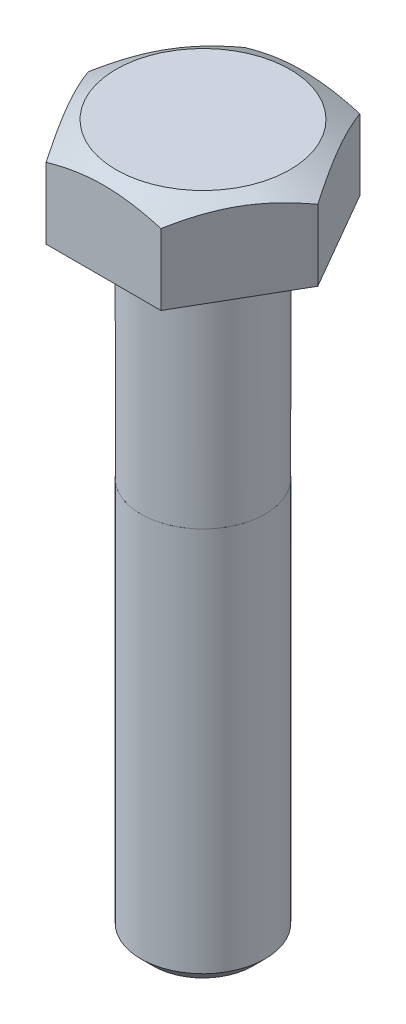
ISO-10303-21;
HEADER;
FILE_DESCRIPTION(('STEP AP214'),'2;1');
FILE_NAME('part.step','',(''),(''),'','','');
FILE_SCHEMA(('AUTOMOTIVE_DESIGN { 1 0 10303 214 1 1 1 1 }'));
ENDSEC;
DATA;
#1=APPLICATION_CONTEXT('core data for automotive mechanical design processes');
#2=APPLICATION_PROTOCOL_DEFINITION('international standard','automotive_design',2000,#1);
#3=PRODUCT_CONTEXT('',#1,'mechanical');
#4=PRODUCT('Part','Part','',(#3));
#5=PRODUCT_RELATED_PRODUCT_CATEGORY('part','',(#4));
#6=PRODUCT_DEFINITION_FORMATION('','',#4);
#7=PRODUCT_DEFINITION_CONTEXT('part definition',#1,'design');
#8=PRODUCT_DEFINITION('design','',#6,#7);
#9=PRODUCT_DEFINITION_SHAPE('','',#8);
#10=(LENGTH_UNIT() NAMED_UNIT(*) SI_UNIT(.MILLI.,.METRE.));
#11=(NAMED_UNIT(*) PLANE_ANGLE_UNIT() SI_UNIT($,.RADIAN.));
#12=(NAMED_UNIT(*) SI_UNIT($,.STERADIAN.) SOLID_ANGLE_UNIT());
#13=UNCERTAINTY_MEASURE_WITH_UNIT(LENGTH_MEASURE(1.E-05),#10,'distance_accuracy_value','');
#14=(GEOMETRIC_REPRESENTATION_CONTEXT(3) GLOBAL_UNCERTAINTY_ASSIGNED_CONTEXT((#13)) GLOBAL_UNIT_ASSIGNED_CONTEXT((#10,
#11,#12)) REPRESENTATION_CONTEXT('',''));
#15=CARTESIAN_POINT('',(0.,0.,0.));
#16=DIRECTION('',(0.,0.,1.));
#17=DIRECTION('',(1.,0.,0.));
#18=AXIS2_PLACEMENT_3D('',#15,#16,#17);
#19=CARTESIAN_POINT('',(0.,-28.5,0.));
#20=DIRECTION('',(0.,1.,0.));
#21=DIRECTION('',(0.,0.,1.));
#22=AXIS2_PLACEMENT_3D('',#19,#20,#21);
#23=CYLINDRICAL_SURFACE('',#22,2.5);
#24=CARTESIAN_POINT('',(0.,-28.,0.));
#25=DIRECTION('',(0.,-1.,0.));
#26=DIRECTION('',(0.,0.,-1.));
#27=AXIS2_PLACEMENT_3D('',#24,#25,#26);
#28=CIRCLE('',#27,2.5);
#29=CARTESIAN_POINT('',(0.,-28.,-2.5));
#30=VERTEX_POINT('',#29);
#31=EDGE_CURVE('E12',#30,#30,#28,.F.);
#32=ORIENTED_EDGE('',*,*,#31,.T.);
#33=EDGE_LOOP('',(#32));
#34=FACE_BOUND('',#33,.T.);
#35=CARTESIAN_POINT('',(0.,-12.5,0.));
#36=DIRECTION('',(0.,-1.,0.));
#37=DIRECTION('',(0.,0.,-1.));
#38=AXIS2_PLACEMENT_3D('',#35,#36,#37);
#39=CIRCLE('',#38,2.5);
#40=CARTESIAN_POINT('',(0.,-12.5,-2.5));
#41=VERTEX_POINT('',#40);
#42=EDGE_CURVE('E52',#41,#41,#39,.T.);
#43=ORIENTED_EDGE('',*,*,#42,.T.);
#44=EDGE_LOOP('',(#43));
#45=FACE_BOUND('',#44,.T.);
#46=ADVANCED_FACE('F41',(#34,#45),#23,.T.);
#47=CARTESIAN_POINT('',(0.,-28.5,0.));
#48=DIRECTION('',(0.,-1.,0.));
#49=DIRECTION('',(0.,0.,-1.));
#50=AXIS2_PLACEMENT_3D('',#47,#48,#49);
#51=PLANE('',#50);
#52=CARTESIAN_POINT('',(0.,-28.5,0.));
#53=DIRECTION('',(0.,-1.,0.));
#54=DIRECTION('',(0.,0.,-1.));
#55=AXIS2_PLACEMENT_3D('',#52,#53,#54);
#56=CIRCLE('',#55,2.);
#57=CARTESIAN_POINT('',(0.,-28.5,-2.));
#58=VERTEX_POINT('',#57);
#59=EDGE_CURVE('E48',#58,#58,#56,.T.);
#60=ORIENTED_EDGE('',*,*,#59,.T.);
#61=EDGE_LOOP('',(#60));
#62=FACE_BOUND('',#61,.T.);
#63=ADVANCED_FACE('F62',(#62),#51,.T.);
#64=CARTESIAN_POINT('',(0.,-12.5,0.));
#65=DIRECTION('',(0.,-1.,0.));
#66=DIRECTION('',(0.,0.,-1.));
#67=AXIS2_PLACEMENT_3D('',#64,#65,#66);
#68=PLANE('',#67);
#69=ORIENTED_EDGE('',*,*,#42,.F.);
#70=EDGE_LOOP('',(#69));
#71=FACE_BOUND('',#70,.T.);
#72=ADVANCED_FACE('F60',(#71),#68,.F.);
#73=CARTESIAN_POINT('',(0.,-28.5,0.));
#74=DIRECTION('',(0.,1.,0.));
#75=DIRECTION('',(0.,0.,1.));
#76=AXIS2_PLACEMENT_3D('',#73,#74,#75);
#77=CONICAL_SURFACE('',#76,2.,0.785398163397443);
#78=ORIENTED_EDGE('',*,*,#31,.F.);
#79=EDGE_LOOP('',(#78));
#80=FACE_BOUND('',#79,.T.);
#81=ORIENTED_EDGE('',*,*,#59,.F.);
#82=EDGE_LOOP('',(#81));
#83=FACE_BOUND('',#82,.T.);
#84=ADVANCED_FACE('F43',(#80,#83),#77,.T.);
#85=CLOSED_SHELL('',(#46,#63,#72,#84));
#86=MANIFOLD_SOLID_BREP('B2',#85);
#87=CARTESIAN_POINT('',(-2.30940107675855,-3.5,-3.99999999999997));
#88=DIRECTION('',(-0.866025403784442,0.,-0.499999999999995));
#89=DIRECTION('',(-0.499999999999995,0.,0.866025403784442));
#90=AXIS2_PLACEMENT_3D('',#87,#88,#89);
#91=PLANE('',#90);
#92=DIRECTION('',(0.,1.,0.));
#93=VECTOR('',#92,1.);
#94=CARTESIAN_POINT('',(-4.61880215351701,-3.5,0.));
#95=LINE('',#94,#93);
#96=CARTESIAN_POINT('',(-4.61880215351701,-3.5,0.));
#97=VERTEX_POINT('',#96);
#98=CARTESIAN_POINT('',(-4.61880215351701,-0.645940724502973,0.));
#99=VERTEX_POINT('',#98);
#100=EDGE_CURVE('E170',#97,#99,#95,.T.);
#101=ORIENTED_EDGE('',*,*,#100,.T.);
#102=CARTESIAN_POINT('',(-4.61891762357084,-0.646007393669577,0.000200000000000209));
#103=CARTESIAN_POINT('',(-4.5174314838138,-0.587393008243094,-0.175579150323229));
#104=CARTESIAN_POINT('',(-4.41506932144052,-0.534085456057075,-0.352875616326382));
#105=CARTESIAN_POINT('',(-4.2085725054774,-0.441036805341217,-0.710538593175709));
#106=CARTESIAN_POINT('',(-4.10443418285647,-0.401328623624518,-0.890911458970154));
#107=CARTESIAN_POINT('',(-3.89744813015756,-0.339517349875095,-1.24942181870279));
#108=CARTESIAN_POINT('',(-3.7946322465506,-0.317002866117705,-1.42750415293515));
#109=CARTESIAN_POINT('',(-3.58851671999024,-0.290125757741399,-1.78450671716652));
#110=CARTESIAN_POINT('',(-3.48521782616118,-0.285740876021762,-1.96342564964411));
#111=CARTESIAN_POINT('',(-3.2921997050462,-0.29486520753479,-2.29774284219674));
#112=CARTESIAN_POINT('',(-3.20245157692488,-0.306134088582814,-2.45319115998707));
#113=CARTESIAN_POINT('',(-3.02354002635499,-0.341849125393013,-2.76307505563505));
#114=CARTESIAN_POINT('',(-2.93437722268075,-0.366307480306352,-2.91750956174412));
#115=CARTESIAN_POINT('',(-2.75509682012357,-0.427451199514107,-3.22803232777457));
#116=CARTESIAN_POINT('',(-2.66500191089423,-0.46439573824968,-3.38408128806309));
#117=CARTESIAN_POINT('',(-2.48615580200005,-0.54824520714284,-3.69385183540382));
#118=CARTESIAN_POINT('',(-2.39740231122589,-0.595130436807552,-3.84757739077375));
#119=CARTESIAN_POINT('',(-2.30928560670471,-0.646007393669577,-4.00019999999997));
#120=B_SPLINE_CURVE_WITH_KNOTS('',3,(#102,#103,#104,#105,#106,#107,#108,#109,#110,#111,#112,
#113,#114,#115,#116,#117,#118,#119),.UNSPECIFIED.,.F.,.F.,(4,2,2,2,2,2,2,2,4),(0.,
0.634047835695966,1.26961969224543,1.88946157213122,2.50854226669297,3.04757825393384,
3.58711366126901,4.1386165314376,4.68903648037738),.UNSPECIFIED.);
#121=CARTESIAN_POINT('',(-2.30940107675896,-0.645940724502701,-3.99999999999997));
#122=VERTEX_POINT('',#121);
#123=EDGE_CURVE('E111',#99,#122,#120,.T.);
#124=ORIENTED_EDGE('',*,*,#123,.T.);
#125=DIRECTION('',(0.,1.,0.));
#126=VECTOR('',#125,1.);
#127=CARTESIAN_POINT('',(-2.30940107675855,-3.5,-3.99999999999997));
#128=LINE('',#127,#126);
#129=CARTESIAN_POINT('',(-2.30940107675855,-3.5,-3.99999999999997));
#130=VERTEX_POINT('',#129);
#131=EDGE_CURVE('E104',#130,#122,#128,.T.);
#132=ORIENTED_EDGE('',*,*,#131,.F.);
#133=DIRECTION('',(-0.499999999999995,0.,0.866025403784442));
#134=VECTOR('',#133,1.);
#135=CARTESIAN_POINT('',(-2.30940107675855,-3.5,-3.99999999999997));
#136=LINE('',#135,#134);
#137=EDGE_CURVE('E193',#130,#97,#136,.T.);
#138=ORIENTED_EDGE('',*,*,#137,.T.);
#139=EDGE_LOOP('',(#101,#124,#132,#138));
#140=FACE_BOUND('',#139,.T.);
#141=ADVANCED_FACE('F96',(#140),#91,.T.);
#142=CARTESIAN_POINT('',(2.30940107675847,-3.5,-4.00000000000002));
#143=DIRECTION('',(0.,0.,-1.));
#144=DIRECTION('',(-1.,0.,0.));
#145=AXIS2_PLACEMENT_3D('',#142,#143,#144);
#146=PLANE('',#145);
#147=ORIENTED_EDGE('',*,*,#131,.T.);
#148=CARTESIAN_POINT('',(-6.2386920841912,-2.25795293966222,-3.99999999999993));
#149=CARTESIAN_POINT('',(-6.0636462144156,-2.17289842349704,-3.99999999999993));
#150=CARTESIAN_POINT('',(-5.88820220942288,-2.08864943358983,-3.99999999999994));
#151=CARTESIAN_POINT('',(-5.53630625966822,-1.92221498867113,-3.99999999999994));
#152=CARTESIAN_POINT('',(-5.35985416432443,-1.84002985239064,-3.99999999999994));
#153=CARTESIAN_POINT('',(-5.00483857589394,-1.67776989271807,-3.99999999999994));
#154=CARTESIAN_POINT('',(-4.82626883952197,-1.59770868272851,-3.99999999999995));
#155=CARTESIAN_POINT('',(-4.46772093692709,-1.4408169744459,-3.99999999999995));
#156=CARTESIAN_POINT('',(-4.28774283678467,-1.36398632564012,-3.99999999999995));
#157=CARTESIAN_POINT('',(-3.92023096366145,-1.2119836575685,-3.99999999999996));
#158=CARTESIAN_POINT('',(-3.73264131099652,-1.13694601597286,-3.99999999999996));
#159=CARTESIAN_POINT('',(-3.35528065120837,-0.992464755220284,-3.99999999999996));
#160=CARTESIAN_POINT('',(-3.16550940404798,-0.923021758496333,-3.99999999999996));
#161=CARTESIAN_POINT('',(-2.78382716206718,-0.79152628438738,-3.99999999999997));
#162=CARTESIAN_POINT('',(-2.59192126079333,-0.729459169059146,-3.99999999999997));
#163=CARTESIAN_POINT('',(-2.20535721062783,-0.614683334100919,-3.99999999999997));
#164=CARTESIAN_POINT('',(-2.01069993747645,-0.561971706021506,-3.99999999999998));
#165=CARTESIAN_POINT('',(-1.61956762794624,-0.468684492535562,-3.99999999999998));
#166=CARTESIAN_POINT('',(-1.42310827900288,-0.428044334831883,-3.99999999999998));
#167=CARTESIAN_POINT('',(-1.02771053321186,-0.361187404628872,-3.99999999999999));
#168=CARTESIAN_POINT('',(-0.8287723969665,-0.334969128782129,-3.99999999999999));
#169=CARTESIAN_POINT('',(-0.43202422198551,-0.299389076257038,-3.99999999999999));
#170=CARTESIAN_POINT('',(-0.23423437117117,-0.289807740258372,-3.99999999999999));
#171=CARTESIAN_POINT('',(0.161454851148497,-0.287733658952416,-4.));
#172=CARTESIAN_POINT('',(0.359354225467821,-0.295241375238883,-4.));
#173=CARTESIAN_POINT('',(0.69421587993035,-0.321869109204495,-4.));
#174=CARTESIAN_POINT('',(0.831532532248929,-0.336797639120489,-4.));
#175=CARTESIAN_POINT('',(1.10517829494913,-0.373972722722937,-4.00000000000001));
#176=CARTESIAN_POINT('',(1.24150727333933,-0.396220236721733,-4.00000000000001));
#177=CARTESIAN_POINT('',(1.64881504225618,-0.472773589082371,-4.00000000000001));
#178=CARTESIAN_POINT('',(1.91797375754035,-0.536877529328741,-4.00000000000002));
#179=CARTESIAN_POINT('',(2.32062768760559,-0.648292970756896,-4.00000000000002));
#180=CARTESIAN_POINT('',(2.45620102533998,-0.688523438763919,-4.00000000000002));
#181=CARTESIAN_POINT('',(2.72603047833974,-0.773221425389597,-4.00000000000002));
#182=CARTESIAN_POINT('',(2.86028658354053,-0.817688976354765,-4.00000000000002));
#183=CARTESIAN_POINT('',(3.12752526120129,-0.910142476964991,-4.00000000000003));
#184=CARTESIAN_POINT('',(3.26050820568575,-0.958127361002033,-4.00000000000003));
#185=CARTESIAN_POINT('',(3.5253661454258,-1.05704497136852,-4.00000000000003));
#186=CARTESIAN_POINT('',(3.6572411660242,-1.10797763005872,-4.00000000000003));
#187=CARTESIAN_POINT('',(4.01446721288898,-1.24979807871173,-4.00000000000004));
#188=CARTESIAN_POINT('',(4.23886403870353,-1.34308714618287,-4.00000000000004));
#189=CARTESIAN_POINT('',(4.68535569758662,-1.5350394226801,-4.00000000000005));
#190=CARTESIAN_POINT('',(4.90745027448332,-1.6337032222735,-4.00000000000005));
#191=CARTESIAN_POINT('',(5.3498652945355,-1.83511614209277,-4.00000000000005));
#192=CARTESIAN_POINT('',(5.57018510122429,-1.93786665574931,-4.00000000000005));
#193=CARTESIAN_POINT('',(6.00935088451956,-2.14647688038397,-4.00000000000006));
#194=CARTESIAN_POINT('',(6.2281968167458,-2.25233668447678,-4.00000000000006));
#195=CARTESIAN_POINT('',(6.66503589878404,-2.46664235343326,-4.00000000000006));
#196=CARTESIAN_POINT('',(6.88302720893254,-2.57509196066299,-4.00000000000007));
#197=CARTESIAN_POINT('',(7.31804173282997,-2.79391769327291,-4.00000000000007));
#198=CARTESIAN_POINT('',(7.53506493662401,-2.90429383840633,-4.00000000000007));
#199=CARTESIAN_POINT('',(8.18485903571492,-3.2376704329208,-4.00000000000008));
#200=CARTESIAN_POINT('',(8.61645133516242,-3.46296704561798,-4.00000000000009));
#201=CARTESIAN_POINT('',(9.4316201905298,-3.8934242038609,-4.00000000000009));
#202=CARTESIAN_POINT('',(9.81541486293091,-4.09817365920157,-4.0000000000001));
#203=CARTESIAN_POINT('',(10.5817465955931,-4.51006741140322,-4.00000000000011));
#204=CARTESIAN_POINT('',(10.9642835774267,-4.71721185410569,-4.00000000000011));
#205=CARTESIAN_POINT('',(11.7271405277234,-5.1325892408828,-4.00000000000012));
#206=CARTESIAN_POINT('',(12.1074636535812,-5.34081639518074,-4.00000000000012));
#207=CARTESIAN_POINT('',(12.8673260809044,-5.75862691883248,-4.00000000000013));
#208=CARTESIAN_POINT('',(13.2468654409213,-5.96821018165787,-4.00000000000013));
#209=CARTESIAN_POINT('',(13.6261299907272,-6.178286570007,-4.00000000000014));
#210=B_SPLINE_CURVE_WITH_KNOTS('',3,(#148,#149,#150,#151,#152,#153,#154,#155,#156,#157,#158,
#159,#160,#161,#162,#163,#164,#165,#166,#167,#168,#169,#170,#171,#172,#173,#174,#175,#176,#177,
#178,#179,#180,#181,#182,#183,#184,#185,#186,#187,#188,#189,#190,#191,#192,#193,#194,#195,#196,
#197,#198,#199,#200,#201,#202,#203,#204,#205,#206,#207,#208,#209),.UNSPECIFIED.,.F.,.F.,(4,2,2,
2,2,2,2,2,2,2,2,2,2,2,2,2,2,2,2,2,2,2,2,2,2,2,2,2,2,2,4),(0.,0.583854507649928,1.16779863509232,
1.75486117528229,2.34189633369219,2.94795004536287,3.55407109077563,4.15896841535693,
4.76367735779939,5.36509081790958,5.96644157435888,6.55979415614866,7.15316276522268,
7.56733997131308,7.98157154262904,8.8104571980024,9.2346697003411,9.65888544143973,
10.0829731895213,10.5070512103968,11.2359937181684,11.9650164832164,12.6942899877904,
13.4235853544074,14.1540073506965,14.8844368405732,16.3449713937757,17.6499479609235,
18.9550044168959,20.2557851154095,21.556464843156),.UNSPECIFIED.);
#211=CARTESIAN_POINT('',(2.30940107675847,-0.645940724502973,-4.00000000000002));
#212=VERTEX_POINT('',#211);
#213=EDGE_CURVE('E200',#122,#212,#210,.T.);
#214=ORIENTED_EDGE('',*,*,#213,.T.);
#215=DIRECTION('',(0.,1.,0.));
#216=VECTOR('',#215,1.);
#217=CARTESIAN_POINT('',(2.30940107675847,-3.5,-4.00000000000002));
#218=LINE('',#217,#216);
#219=CARTESIAN_POINT('',(2.30940107675847,-3.5,-4.00000000000002));
#220=VERTEX_POINT('',#219);
#221=EDGE_CURVE('E178',#220,#212,#218,.T.);
#222=ORIENTED_EDGE('',*,*,#221,.F.);
#223=DIRECTION('',(-1.,0.,0.));
#224=VECTOR('',#223,1.);
#225=CARTESIAN_POINT('',(2.30940107675847,-3.5,-4.00000000000002));
#226=LINE('',#225,#224);
#227=EDGE_CURVE('E174',#220,#130,#226,.T.);
#228=ORIENTED_EDGE('',*,*,#227,.T.);
#229=EDGE_LOOP('',(#147,#214,#222,#228));
#230=FACE_BOUND('',#229,.T.);
#231=ADVANCED_FACE('F243',(#230),#146,.T.);
#232=CARTESIAN_POINT('',(4.61880215351701,-3.5,0.));
#233=DIRECTION('',(0.866025403784434,0.,-0.500000000000007));
#234=DIRECTION('',(-0.500000000000007,0.,-0.866025403784435));
#235=AXIS2_PLACEMENT_3D('',#232,#233,#234);
#236=PLANE('',#235);
#237=ORIENTED_EDGE('',*,*,#221,.T.);
#238=CARTESIAN_POINT('',(2.30928560670463,-0.646007393669576,-4.00020000000002));
#239=CARTESIAN_POINT('',(2.41077174646167,-0.587393008243092,-3.82442084967679));
#240=CARTESIAN_POINT('',(2.51313390883496,-0.534085456057073,-3.64712438367364));
#241=CARTESIAN_POINT('',(2.71963072479808,-0.441036805341213,-3.28946140682432));
#242=CARTESIAN_POINT('',(2.82376904741901,-0.401328623624514,-3.10908854102987));
#243=CARTESIAN_POINT('',(3.03075510011792,-0.339517349875089,-2.75057818129724));
#244=CARTESIAN_POINT('',(3.13357098372489,-0.317002866117699,-2.57249584706488));
#245=CARTESIAN_POINT('',(3.33968651028526,-0.290125757741391,-2.21549328283352));
#246=CARTESIAN_POINT('',(3.44298540411432,-0.285740876021753,-2.03657435035593));
#247=CARTESIAN_POINT('',(3.6360035252293,-0.294865207534779,-1.7022571578033));
#248=CARTESIAN_POINT('',(3.72575165335063,-0.306134088582803,-1.54680884001297));
#249=CARTESIAN_POINT('',(3.90466320392053,-0.341849125393002,-1.23692494436498));
#250=CARTESIAN_POINT('',(3.99382600759477,-0.366307480306342,-1.0824904382559));
#251=CARTESIAN_POINT('',(4.17310641015196,-0.427451199514099,-0.771967672225454));
#252=CARTESIAN_POINT('',(4.2632013193813,-0.464395738249673,-0.615918711936929));
#253=CARTESIAN_POINT('',(4.4420474282755,-0.548245207142837,-0.306148164596192));
#254=CARTESIAN_POINT('',(4.53080091904966,-0.59513043680755,-0.152422609226253));
#255=CARTESIAN_POINT('',(4.61891762357084,-0.646007393669577,0.000199999999967827));
#256=B_SPLINE_CURVE_WITH_KNOTS('',3,(#238,#239,#240,#241,#242,#243,#244,#245,#246,#247,#248,
#249,#250,#251,#252,#253,#254,#255),.UNSPECIFIED.,.F.,.F.,(4,2,2,2,2,2,2,2,4),(0.,
0.634047835695965,1.26961969224543,1.88946157213122,2.50854226669297,3.04757825393386,
3.58711366126904,4.13861653143764,4.68903648037744),.UNSPECIFIED.);
#257=CARTESIAN_POINT('',(4.61880215351701,-0.645940724502973,0.));
#258=VERTEX_POINT('',#257);
#259=EDGE_CURVE('E233',#212,#258,#256,.T.);
#260=ORIENTED_EDGE('',*,*,#259,.T.);
#261=DIRECTION('',(0.,1.,0.));
#262=VECTOR('',#261,1.);
#263=CARTESIAN_POINT('',(4.61880215351701,-3.5,0.));
#264=LINE('',#263,#262);
#265=CARTESIAN_POINT('',(4.61880215351701,-3.5,0.));
#266=VERTEX_POINT('',#265);
#267=EDGE_CURVE('E172',#266,#258,#264,.T.);
#268=ORIENTED_EDGE('',*,*,#267,.F.);
#269=DIRECTION('',(-0.500000000000007,0.,-0.866025403784434));
#270=VECTOR('',#269,1.);
#271=CARTESIAN_POINT('',(4.61880215351701,-3.5,0.));
#272=LINE('',#271,#270);
#273=EDGE_CURVE('E184',#266,#220,#272,.T.);
#274=ORIENTED_EDGE('',*,*,#273,.T.);
#275=EDGE_LOOP('',(#237,#260,#268,#274));
#276=FACE_BOUND('',#275,.T.);
#277=ADVANCED_FACE('F239',(#276),#236,.T.);
#278=CARTESIAN_POINT('',(2.30940107675852,-3.5,3.99999999999999));
#279=DIRECTION('',(0.866025403784441,0.,0.499999999999995));
#280=DIRECTION('',(0.499999999999995,0.,-0.866025403784441));
#281=AXIS2_PLACEMENT_3D('',#278,#279,#280);
#282=PLANE('',#281);
#283=ORIENTED_EDGE('',*,*,#267,.T.);
#284=CARTESIAN_POINT('',(4.61891762357084,-0.646007393669577,-0.000200000000032253));
#285=CARTESIAN_POINT('',(4.51743148381381,-0.587393008243093,0.175579150323196));
#286=CARTESIAN_POINT('',(4.41506932144052,-0.534085456057073,0.35287561632635));
#287=CARTESIAN_POINT('',(4.2085725054774,-0.441036805341214,0.710538593175676));
#288=CARTESIAN_POINT('',(4.10443418285647,-0.401328623624514,0.890911458970121));
#289=CARTESIAN_POINT('',(3.89744813015757,-0.339517349875089,1.24942181870276));
#290=CARTESIAN_POINT('',(3.7946322465506,-0.317002866117699,1.42750415293511));
#291=CARTESIAN_POINT('',(3.58851671999024,-0.290125757741391,1.78450671716648));
#292=CARTESIAN_POINT('',(3.48521782616118,-0.285740876021752,1.96342564964407));
#293=CARTESIAN_POINT('',(3.2921997050462,-0.294865207534779,2.29774284219671));
#294=CARTESIAN_POINT('',(3.20245157692488,-0.306134088582803,2.45319115998704));
#295=CARTESIAN_POINT('',(3.02354002635498,-0.341849125393002,2.76307505563503));
#296=CARTESIAN_POINT('',(2.93437722268074,-0.366307480306342,2.91750956174411));
#297=CARTESIAN_POINT('',(2.75509682012355,-0.427451199514099,3.22803232777456));
#298=CARTESIAN_POINT('',(2.66500191089421,-0.464395738249673,3.38408128806309));
#299=CARTESIAN_POINT('',(2.48615580200002,-0.548245207142836,3.69385183540382));
#300=CARTESIAN_POINT('',(2.39740231122586,-0.59513043680755,3.84757739077377));
#301=CARTESIAN_POINT('',(2.30928560670468,-0.646007393669576,4.00019999999999));
#302=B_SPLINE_CURVE_WITH_KNOTS('',3,(#284,#285,#286,#287,#288,#289,#290,#291,#292,#293,#294,
#295,#296,#297,#298,#299,#300,#301),.UNSPECIFIED.,.F.,.F.,(4,2,2,2,2,2,2,2,4),(0.,
0.634047835695966,1.26961969224543,1.88946157213122,2.50854226669297,3.04757825393386,
3.58711366126904,4.13861653143764,4.68903648037744),.UNSPECIFIED.);
#303=CARTESIAN_POINT('',(2.30940107675852,-0.645940724502973,3.99999999999999));
#304=VERTEX_POINT('',#303);
#305=EDGE_CURVE('E164',#258,#304,#302,.T.);
#306=ORIENTED_EDGE('',*,*,#305,.T.);
#307=DIRECTION('',(0.,1.,0.));
#308=VECTOR('',#307,1.);
#309=CARTESIAN_POINT('',(2.30940107675852,-3.5,3.99999999999999));
#310=LINE('',#309,#308);
#311=CARTESIAN_POINT('',(2.30940107675852,-3.5,3.99999999999999));
#312=VERTEX_POINT('',#311);
#313=EDGE_CURVE('E163',#312,#304,#310,.T.);
#314=ORIENTED_EDGE('',*,*,#313,.F.);
#315=DIRECTION('',(0.499999999999995,0.,-0.866025403784441));
#316=VECTOR('',#315,1.);
#317=CARTESIAN_POINT('',(2.30940107675852,-3.5,3.99999999999999));
#318=LINE('',#317,#316);
#319=EDGE_CURVE('E187',#312,#266,#318,.T.);
#320=ORIENTED_EDGE('',*,*,#319,.T.);
#321=EDGE_LOOP('',(#283,#306,#314,#320));
#322=FACE_BOUND('',#321,.T.);
#323=ADVANCED_FACE('F242',(#322),#282,.T.);
#324=CARTESIAN_POINT('',(-2.30940107675849,-3.5,4.));
#325=DIRECTION('',(0.,0.,1.));
#326=DIRECTION('',(1.,0.,0.));
#327=AXIS2_PLACEMENT_3D('',#324,#325,#326);
#328=PLANE('',#327);
#329=ORIENTED_EDGE('',*,*,#313,.T.);
#330=CARTESIAN_POINT('',(-6.23869208419115,-2.25795293966222,4.00000000000002));
#331=CARTESIAN_POINT('',(-6.06364621441554,-2.17289842349704,4.00000000000002));
#332=CARTESIAN_POINT('',(-5.88820220942283,-2.08864943358983,4.00000000000002));
#333=CARTESIAN_POINT('',(-5.53630625966816,-1.92221498867113,4.00000000000002));
#334=CARTESIAN_POINT('',(-5.35985416432437,-1.84002985239064,4.00000000000002));
#335=CARTESIAN_POINT('',(-5.00483857589389,-1.67776989271807,4.00000000000001));
#336=CARTESIAN_POINT('',(-4.82626883952191,-1.59770868272851,4.00000000000001));
#337=CARTESIAN_POINT('',(-4.46772093692704,-1.4408169744459,4.00000000000001));
#338=CARTESIAN_POINT('',(-4.28774283678461,-1.36398632564012,4.00000000000001));
#339=CARTESIAN_POINT('',(-3.9202309636614,-1.2119836575685,4.00000000000001));
#340=CARTESIAN_POINT('',(-3.73264131099646,-1.13694601597286,4.00000000000001));
#341=CARTESIAN_POINT('',(-3.35528065120831,-0.992464755220283,4.00000000000001));
#342=CARTESIAN_POINT('',(-3.16550940404793,-0.923021758496333,4.00000000000001));
#343=CARTESIAN_POINT('',(-2.78382716206712,-0.79152628438738,4.00000000000001));
#344=CARTESIAN_POINT('',(-2.59192126079327,-0.729459169059146,4.00000000000001));
#345=CARTESIAN_POINT('',(-2.20535721062778,-0.614683334100919,4.));
#346=CARTESIAN_POINT('',(-2.01069993747639,-0.561971706021506,4.));
#347=CARTESIAN_POINT('',(-1.61956762794619,-0.468684492535562,4.));
#348=CARTESIAN_POINT('',(-1.42310827900283,-0.428044334831883,4.));
#349=CARTESIAN_POINT('',(-1.0277105332118,-0.361187404628873,4.));
#350=CARTESIAN_POINT('',(-0.828772396966445,-0.334969128782128,4.));
#351=CARTESIAN_POINT('',(-0.432024221985455,-0.299389076257038,4.));
#352=CARTESIAN_POINT('',(-0.234234371171115,-0.289807740258372,4.));
#353=CARTESIAN_POINT('',(0.161454851148553,-0.287733658952416,4.));
#354=CARTESIAN_POINT('',(0.359354225467876,-0.295241375238883,3.99999999999999));
#355=CARTESIAN_POINT('',(0.694215879930405,-0.321869109204495,3.99999999999999));
#356=CARTESIAN_POINT('',(0.831532532248984,-0.336797639120488,3.99999999999999));
#357=CARTESIAN_POINT('',(1.10517829494918,-0.373972722722936,3.99999999999999));
#358=CARTESIAN_POINT('',(1.24150727333939,-0.396220236721732,3.99999999999999));
#359=CARTESIAN_POINT('',(1.64881504225623,-0.472773589082371,3.99999999999999));
#360=CARTESIAN_POINT('',(1.91797375754041,-0.536877529328741,3.99999999999999));
#361=CARTESIAN_POINT('',(2.32062768760564,-0.648292970756896,3.99999999999999));
#362=CARTESIAN_POINT('',(2.45620102534004,-0.688523438763918,3.99999999999999));
#363=CARTESIAN_POINT('',(2.72603047833979,-0.773221425389596,3.99999999999999));
#364=CARTESIAN_POINT('',(2.86028658354058,-0.817688976354764,3.99999999999999));
#365=CARTESIAN_POINT('',(3.12752526120134,-0.910142476964991,3.99999999999999));
#366=CARTESIAN_POINT('',(3.26050820568581,-0.958127361002033,3.99999999999998));
#367=CARTESIAN_POINT('',(3.52536614542585,-1.05704497136852,3.99999999999998));
#368=CARTESIAN_POINT('',(3.65724116602425,-1.10797763005871,3.99999999999998));
#369=CARTESIAN_POINT('',(4.01446721288903,-1.24979807871172,3.99999999999998));
#370=CARTESIAN_POINT('',(4.23886403870359,-1.34308714618287,3.99999999999998));
#371=CARTESIAN_POINT('',(4.68535569758667,-1.5350394226801,3.99999999999998));
#372=CARTESIAN_POINT('',(4.90745027448338,-1.6337032222735,3.99999999999998));
#373=CARTESIAN_POINT('',(5.34986529453556,-1.83511614209277,3.99999999999998));
#374=CARTESIAN_POINT('',(5.57018510122434,-1.93786665574931,3.99999999999998));
#375=CARTESIAN_POINT('',(6.00935088451961,-2.14647688038397,3.99999999999998));
#376=CARTESIAN_POINT('',(6.22819681674586,-2.25233668447678,3.99999999999997));
#377=CARTESIAN_POINT('',(6.66503589878409,-2.46664235343326,3.99999999999997));
#378=CARTESIAN_POINT('',(6.88302720893259,-2.57509196066299,3.99999999999997));
#379=CARTESIAN_POINT('',(7.31804173283002,-2.79391769327291,3.99999999999997));
#380=CARTESIAN_POINT('',(7.53506493662406,-2.90429383840632,3.99999999999997));
#381=CARTESIAN_POINT('',(8.18485903571497,-3.2376704329208,3.99999999999997));
#382=CARTESIAN_POINT('',(8.61645133516248,-3.46296704561798,3.99999999999997));
#383=CARTESIAN_POINT('',(9.43162019052985,-3.8934242038609,3.99999999999996));
#384=CARTESIAN_POINT('',(9.81541486293096,-4.09817365920156,3.99999999999996));
#385=CARTESIAN_POINT('',(10.5817465955932,-4.51006741140322,3.99999999999996));
#386=CARTESIAN_POINT('',(10.9642835774267,-4.71721185410569,3.99999999999996));
#387=CARTESIAN_POINT('',(11.7271405277235,-5.1325892408828,3.99999999999995));
#388=CARTESIAN_POINT('',(12.1074636535812,-5.34081639518074,3.99999999999995));
#389=CARTESIAN_POINT('',(12.8673260809045,-5.75862691883248,3.99999999999995));
#390=CARTESIAN_POINT('',(13.2468654409213,-5.96821018165787,3.99999999999995));
#391=CARTESIAN_POINT('',(13.6261299907273,-6.178286570007,3.99999999999995));
#392=B_SPLINE_CURVE_WITH_KNOTS('',3,(#330,#331,#332,#333,#334,#335,#336,#337,#338,#339,#340,
#341,#342,#343,#344,#345,#346,#347,#348,#349,#350,#351,#352,#353,#354,#355,#356,#357,#358,#359,
#360,#361,#362,#363,#364,#365,#366,#367,#368,#369,#370,#371,#372,#373,#374,#375,#376,#377,#378,
#379,#380,#381,#382,#383,#384,#385,#386,#387,#388,#389,#390,#391),.UNSPECIFIED.,.F.,.F.,(4,2,2,
2,2,2,2,2,2,2,2,2,2,2,2,2,2,2,2,2,2,2,2,2,2,2,2,2,2,2,4),(0.,0.58385450764993,1.16779863509232,
1.75486117528229,2.34189633369219,2.94795004536287,3.55407109077563,4.15896841535693,
4.76367735779939,5.36509081790957,5.96644157435888,6.55979415614865,7.15316276522268,
7.56733997131308,7.98157154262904,8.8104571980024,9.2346697003411,9.65888544143973,
10.0829731895213,10.5070512103968,11.2359937181684,11.9650164832164,12.6942899877904,
13.4235853544074,14.1540073506965,14.8844368405732,16.3449713937757,17.6499479609235,
18.9550044168959,20.2557851154095,21.556464843156),.UNSPECIFIED.);
#393=CARTESIAN_POINT('',(-2.30940107675849,-0.645940724502973,4.));
#394=VERTEX_POINT('',#393);
#395=EDGE_CURVE('E150',#304,#394,#392,.F.);
#396=ORIENTED_EDGE('',*,*,#395,.T.);
#397=DIRECTION('',(0.,1.,0.));
#398=VECTOR('',#397,1.);
#399=CARTESIAN_POINT('',(-2.30940107675849,-3.5,4.));
#400=LINE('',#399,#398);
#401=CARTESIAN_POINT('',(-2.30940107675849,-3.5,4.));
#402=VERTEX_POINT('',#401);
#403=EDGE_CURVE('E161',#402,#394,#400,.T.);
#404=ORIENTED_EDGE('',*,*,#403,.F.);
#405=DIRECTION('',(1.,0.,0.));
#406=VECTOR('',#405,1.);
#407=CARTESIAN_POINT('',(-2.30940107675849,-3.5,4.));
#408=LINE('',#407,#406);
#409=EDGE_CURVE('E190',#402,#312,#408,.T.);
#410=ORIENTED_EDGE('',*,*,#409,.T.);
#411=EDGE_LOOP('',(#329,#396,#404,#410));
#412=FACE_BOUND('',#411,.T.);
#413=ADVANCED_FACE('F159',(#412),#328,.T.);
#414=CARTESIAN_POINT('',(-4.61880215351701,-3.5,0.));
#415=DIRECTION('',(-0.866025403784438,0.,0.500000000000001));
#416=DIRECTION('',(0.500000000000001,0.,0.866025403784438));
#417=AXIS2_PLACEMENT_3D('',#414,#415,#416);
#418=PLANE('',#417);
#419=ORIENTED_EDGE('',*,*,#403,.T.);
#420=CARTESIAN_POINT('',(-2.30928560670466,-0.646007393669577,4.0002));
#421=CARTESIAN_POINT('',(-2.4107717464617,-0.587393008243093,3.82442084967678));
#422=CARTESIAN_POINT('',(-2.51313390883499,-0.534085456057073,3.64712438367362));
#423=CARTESIAN_POINT('',(-2.71963072479811,-0.441036805341214,3.2894614068243));
#424=CARTESIAN_POINT('',(-2.82376904741903,-0.401328623624514,3.10908854102985));
#425=CARTESIAN_POINT('',(-3.03075510011794,-0.339517349875089,2.75057818129721));
#426=CARTESIAN_POINT('',(-3.13357098372491,-0.317002866117698,2.57249584706486));
#427=CARTESIAN_POINT('',(-3.33968651028528,-0.290125757741391,2.2154932828335));
#428=CARTESIAN_POINT('',(-3.44298540411433,-0.285740876021753,2.03657435035591));
#429=CARTESIAN_POINT('',(-3.63600352522932,-0.29486520753478,1.70225715780327));
#430=CARTESIAN_POINT('',(-3.72575165335064,-0.306134088582803,1.54680884001294));
#431=CARTESIAN_POINT('',(-3.90466320392054,-0.341849125393002,1.23692494436495));
#432=CARTESIAN_POINT('',(-3.99382600759478,-0.366307480306342,1.08249043825587));
#433=CARTESIAN_POINT('',(-4.17310641015197,-0.427451199514099,0.771967672225425));
#434=CARTESIAN_POINT('',(-4.26320131938131,-0.464395738249673,0.6159187119369));
#435=CARTESIAN_POINT('',(-4.4420474282755,-0.548245207142837,0.306148164596162));
#436=CARTESIAN_POINT('',(-4.53080091904966,-0.59513043680755,0.152422609226222));
#437=CARTESIAN_POINT('',(-4.61891762357084,-0.646007393669577,-0.000199999999999995));
#438=B_SPLINE_CURVE_WITH_KNOTS('',3,(#420,#421,#422,#423,#424,#425,#426,#427,#428,#429,#430,
#431,#432,#433,#434,#435,#436,#437),.UNSPECIFIED.,.F.,.F.,(4,2,2,2,2,2,2,2,4),(0.,
0.634047835695967,1.26961969224543,1.88946157213122,2.50854226669297,3.04757825393386,
3.58711366126904,4.13861653143764,4.68903648037744),.UNSPECIFIED.);
#439=EDGE_CURVE('E146',#394,#99,#438,.T.);
#440=ORIENTED_EDGE('',*,*,#439,.T.);
#441=ORIENTED_EDGE('',*,*,#100,.F.);
#442=DIRECTION('',(0.500000000000001,0.,0.866025403784438));
#443=VECTOR('',#442,1.);
#444=CARTESIAN_POINT('',(-4.61880215351701,-3.5,0.));
#445=LINE('',#444,#443);
#446=EDGE_CURVE('E169',#97,#402,#445,.T.);
#447=ORIENTED_EDGE('',*,*,#446,.T.);
#448=EDGE_LOOP('',(#419,#440,#441,#447));
#449=FACE_BOUND('',#448,.T.);
#450=ADVANCED_FACE('F167',(#449),#418,.T.);
#451=CARTESIAN_POINT('',(0.,-3.5,0.));
#452=DIRECTION('',(0.,1.,0.));
#453=DIRECTION('',(0.,0.,1.));
#454=AXIS2_PLACEMENT_3D('',#451,#452,#453);
#455=PLANE('',#454);
#456=CARTESIAN_POINT('',(0.,-3.5,0.));
#457=DIRECTION('',(0.,1.,0.));
#458=DIRECTION('',(0.,0.,1.));
#459=AXIS2_PLACEMENT_3D('',#456,#457,#458);
#460=CIRCLE('',#459,2.5);
#461=CARTESIAN_POINT('',(0.,-3.5,2.5));
#462=VERTEX_POINT('',#461);
#463=EDGE_CURVE('E39',#462,#462,#460,.F.);
#464=ORIENTED_EDGE('',*,*,#463,.F.);
#465=EDGE_LOOP('',(#464));
#466=FACE_BOUND('',#465,.T.);
#467=ORIENTED_EDGE('',*,*,#137,.F.);
#468=ORIENTED_EDGE('',*,*,#227,.F.);
#469=ORIENTED_EDGE('',*,*,#273,.F.);
#470=ORIENTED_EDGE('',*,*,#319,.F.);
#471=ORIENTED_EDGE('',*,*,#409,.F.);
#472=ORIENTED_EDGE('',*,*,#446,.F.);
#473=EDGE_LOOP('',(#467,#468,#469,#470,#471,#472));
#474=FACE_BOUND('',#473,.T.);
#475=ADVANCED_FACE('F211',(#466,#474),#455,.F.);
#476=CARTESIAN_POINT('',(0.,0.,0.));
#477=DIRECTION('',(0.,-1.,0.));
#478=DIRECTION('',(0.,0.,1.));
#479=AXIS2_PLACEMENT_3D('',#476,#477,#478);
#480=CONICAL_SURFACE('',#479,3.5,1.0471975511966);
#481=ORIENTED_EDGE('',*,*,#439,.F.);
#482=ORIENTED_EDGE('',*,*,#395,.F.);
#483=ORIENTED_EDGE('',*,*,#305,.F.);
#484=ORIENTED_EDGE('',*,*,#259,.F.);
#485=ORIENTED_EDGE('',*,*,#213,.F.);
#486=ORIENTED_EDGE('',*,*,#123,.F.);
#487=EDGE_LOOP('',(#481,#482,#483,#484,#485,#486));
#488=FACE_BOUND('',#487,.T.);
#489=CARTESIAN_POINT('',(0.,0.,0.));
#490=DIRECTION('',(0.,1.,0.));
#491=DIRECTION('',(0.,0.,1.));
#492=AXIS2_PLACEMENT_3D('',#489,#490,#491);
#493=CIRCLE('',#492,3.5);
#494=CARTESIAN_POINT('',(0.,0.,3.5));
#495=VERTEX_POINT('',#494);
#496=EDGE_CURVE('E155',#495,#495,#493,.T.);
#497=ORIENTED_EDGE('',*,*,#496,.F.);
#498=EDGE_LOOP('',(#497));
#499=FACE_BOUND('',#498,.T.);
#500=ADVANCED_FACE('F148',(#488,#499),#480,.T.);
#501=CARTESIAN_POINT('',(0.,0.,0.));
#502=DIRECTION('',(0.,1.,0.));
#503=DIRECTION('',(0.,0.,1.));
#504=AXIS2_PLACEMENT_3D('',#501,#502,#503);
#505=PLANE('',#504);
#506=ORIENTED_EDGE('',*,*,#496,.T.);
#507=EDGE_LOOP('',(#506));
#508=FACE_BOUND('',#507,.T.);
#509=ADVANCED_FACE('F210',(#508),#505,.T.);
#510=CARTESIAN_POINT('',(0.,-12.5,0.));
#511=DIRECTION('',(0.,1.,0.));
#512=DIRECTION('',(0.,0.,1.));
#513=AXIS2_PLACEMENT_3D('',#510,#511,#512);
#514=CYLINDRICAL_SURFACE('',#513,2.5);
#515=CARTESIAN_POINT('',(0.,-12.5,0.));
#516=DIRECTION('',(0.,-1.,0.));
#517=DIRECTION('',(0.,0.,-1.));
#518=AXIS2_PLACEMENT_3D('',#515,#516,#517);
#519=CIRCLE('',#518,2.5);
#520=CARTESIAN_POINT('',(0.,-12.5,-2.5));
#521=VERTEX_POINT('',#520);
#522=EDGE_CURVE('E329',#521,#521,#519,.T.);
#523=ORIENTED_EDGE('',*,*,#522,.F.);
#524=EDGE_LOOP('',(#523));
#525=FACE_BOUND('',#524,.T.);
#526=ORIENTED_EDGE('',*,*,#463,.T.);
#527=EDGE_LOOP('',(#526));
#528=FACE_BOUND('',#527,.T.);
#529=ADVANCED_FACE('F212',(#525,#528),#514,.T.);
#530=CARTESIAN_POINT('',(0.,-12.5,0.));
#531=DIRECTION('',(0.,-1.,0.));
#532=DIRECTION('',(0.,0.,-1.));
#533=AXIS2_PLACEMENT_3D('',#530,#531,#532);
#534=PLANE('',#533);
#535=ORIENTED_EDGE('',*,*,#522,.T.);
#536=EDGE_LOOP('',(#535));
#537=FACE_BOUND('',#536,.T.);
#538=ADVANCED_FACE('F315',(#537),#534,.T.);
#539=CLOSED_SHELL('',(#141,#231,#277,#323,#413,#450,#475,#500,#509,#529,#538));
#540=MANIFOLD_SOLID_BREP('B7',#539);
#541=ADVANCED_BREP_SHAPE_REPRESENTATION('',(#18,#86,#540),#14);
#542=SHAPE_DEFINITION_REPRESENTATION(#9,#541);
ENDSEC;
END-ISO-10303-21;
